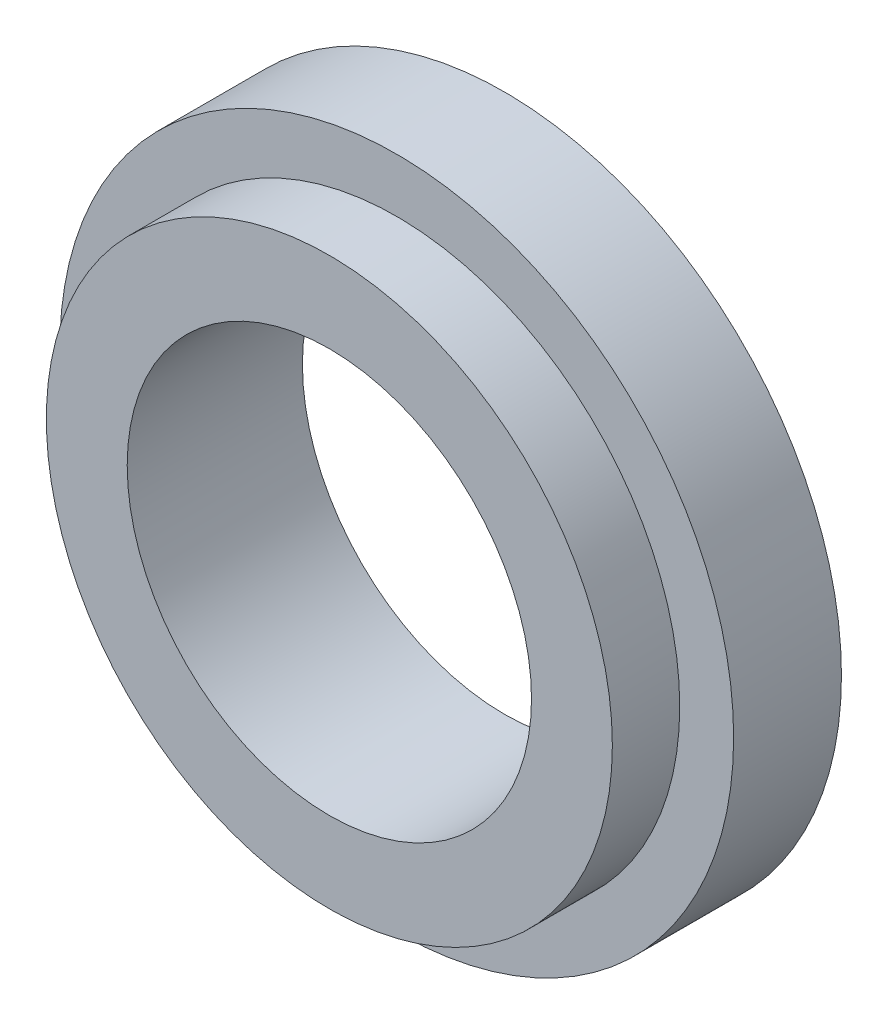
ISO-10303-21;
HEADER;
FILE_DESCRIPTION(('STEP AP214'),'2;1');
FILE_NAME('part.step','',(''),(''),'','','');
FILE_SCHEMA(('AUTOMOTIVE_DESIGN { 1 0 10303 214 1 1 1 1 }'));
ENDSEC;
DATA;
#1=APPLICATION_CONTEXT('core data for automotive mechanical design processes');
#2=APPLICATION_PROTOCOL_DEFINITION('international standard','automotive_design',2000,#1);
#3=PRODUCT_CONTEXT('',#1,'mechanical');
#4=PRODUCT('Part','Part','',(#3));
#5=PRODUCT_RELATED_PRODUCT_CATEGORY('part','',(#4));
#6=PRODUCT_DEFINITION_FORMATION('','',#4);
#7=PRODUCT_DEFINITION_CONTEXT('part definition',#1,'design');
#8=PRODUCT_DEFINITION('design','',#6,#7);
#9=PRODUCT_DEFINITION_SHAPE('','',#8);
#10=(LENGTH_UNIT() NAMED_UNIT(*) SI_UNIT(.MILLI.,.METRE.));
#11=(NAMED_UNIT(*) PLANE_ANGLE_UNIT() SI_UNIT($,.RADIAN.));
#12=(NAMED_UNIT(*) SI_UNIT($,.STERADIAN.) SOLID_ANGLE_UNIT());
#13=UNCERTAINTY_MEASURE_WITH_UNIT(LENGTH_MEASURE(1.E-05),#10,'distance_accuracy_value','');
#14=(GEOMETRIC_REPRESENTATION_CONTEXT(3) GLOBAL_UNCERTAINTY_ASSIGNED_CONTEXT((#13)) GLOBAL_UNIT_ASSIGNED_CONTEXT((#10,
#11,#12)) REPRESENTATION_CONTEXT('',''));
#15=CARTESIAN_POINT('',(0.,0.,0.));
#16=DIRECTION('',(0.,0.,1.));
#17=DIRECTION('',(1.,0.,0.));
#18=AXIS2_PLACEMENT_3D('',#15,#16,#17);
#19=CARTESIAN_POINT('',(0.,0.,8.));
#20=DIRECTION('',(0.,0.,1.));
#21=DIRECTION('',(1.,0.,0.));
#22=AXIS2_PLACEMENT_3D('',#19,#20,#21);
#23=PLANE('',#22);
#24=CARTESIAN_POINT('',(0.,0.,8.));
#25=DIRECTION('',(0.,0.,1.));
#26=DIRECTION('',(1.,0.,0.));
#27=AXIS2_PLACEMENT_3D('',#24,#25,#26);
#28=CIRCLE('',#27,25.);
#29=CARTESIAN_POINT('',(25.,0.,8.));
#30=VERTEX_POINT('',#29);
#31=EDGE_CURVE('E10',#30,#30,#28,.T.);
#32=ORIENTED_EDGE('',*,*,#31,.T.);
#33=EDGE_LOOP('',(#32));
#34=FACE_BOUND('',#33,.T.);
#35=CARTESIAN_POINT('',(0.,0.,8.));
#36=DIRECTION('',(0.,0.,1.));
#37=DIRECTION('',(1.,0.,0.));
#38=AXIS2_PLACEMENT_3D('',#35,#36,#37);
#39=CIRCLE('',#38,21.);
#40=CARTESIAN_POINT('',(21.,0.,8.));
#41=VERTEX_POINT('',#40);
#42=EDGE_CURVE('E45',#41,#41,#39,.T.);
#43=ORIENTED_EDGE('',*,*,#42,.F.);
#44=EDGE_LOOP('',(#43));
#45=FACE_BOUND('',#44,.T.);
#46=ADVANCED_FACE('F32',(#34,#45),#23,.T.);
#47=CARTESIAN_POINT('',(0.,0.,8.));
#48=DIRECTION('',(0.,0.,-1.));
#49=DIRECTION('',(-1.,0.,0.));
#50=AXIS2_PLACEMENT_3D('',#47,#48,#49);
#51=CYLINDRICAL_SURFACE('',#50,25.);
#52=ORIENTED_EDGE('',*,*,#31,.F.);
#53=EDGE_LOOP('',(#52));
#54=FACE_BOUND('',#53,.T.);
#55=CARTESIAN_POINT('',(0.,0.,0.));
#56=DIRECTION('',(0.,0.,1.));
#57=DIRECTION('',(1.,0.,0.));
#58=AXIS2_PLACEMENT_3D('',#55,#56,#57);
#59=CIRCLE('',#58,25.);
#60=CARTESIAN_POINT('',(25.,0.,0.));
#61=VERTEX_POINT('',#60);
#62=EDGE_CURVE('E36',#61,#61,#59,.T.);
#63=ORIENTED_EDGE('',*,*,#62,.T.);
#64=EDGE_LOOP('',(#63));
#65=FACE_BOUND('',#64,.T.);
#66=ADVANCED_FACE('F34',(#54,#65),#51,.T.);
#67=CARTESIAN_POINT('',(0.,0.,0.));
#68=DIRECTION('',(0.,0.,1.));
#69=DIRECTION('',(1.,0.,0.));
#70=AXIS2_PLACEMENT_3D('',#67,#68,#69);
#71=PLANE('',#70);
#72=CARTESIAN_POINT('',(0.,0.,0.));
#73=DIRECTION('',(0.,0.,1.));
#74=DIRECTION('',(1.,0.,0.));
#75=AXIS2_PLACEMENT_3D('',#72,#73,#74);
#76=CIRCLE('',#75,15.);
#77=CARTESIAN_POINT('',(15.,0.,0.));
#78=VERTEX_POINT('',#77);
#79=EDGE_CURVE('E48',#78,#78,#76,.T.);
#80=ORIENTED_EDGE('',*,*,#79,.T.);
#81=EDGE_LOOP('',(#80));
#82=FACE_BOUND('',#81,.T.);
#83=ORIENTED_EDGE('',*,*,#62,.F.);
#84=EDGE_LOOP('',(#83));
#85=FACE_BOUND('',#84,.T.);
#86=ADVANCED_FACE('F57',(#82,#85),#71,.F.);
#87=CARTESIAN_POINT('',(0.,0.,13.));
#88=DIRECTION('',(0.,0.,-1.));
#89=DIRECTION('',(-1.,0.,0.));
#90=AXIS2_PLACEMENT_3D('',#87,#88,#89);
#91=CYLINDRICAL_SURFACE('',#90,21.);
#92=CARTESIAN_POINT('',(0.,0.,13.));
#93=DIRECTION('',(0.,0.,1.));
#94=DIRECTION('',(1.,0.,0.));
#95=AXIS2_PLACEMENT_3D('',#92,#93,#94);
#96=CIRCLE('',#95,21.);
#97=CARTESIAN_POINT('',(21.,0.,13.));
#98=VERTEX_POINT('',#97);
#99=EDGE_CURVE('E43',#98,#98,#96,.T.);
#100=ORIENTED_EDGE('',*,*,#99,.F.);
#101=EDGE_LOOP('',(#100));
#102=FACE_BOUND('',#101,.T.);
#103=ORIENTED_EDGE('',*,*,#42,.T.);
#104=EDGE_LOOP('',(#103));
#105=FACE_BOUND('',#104,.T.);
#106=ADVANCED_FACE('F69',(#102,#105),#91,.T.);
#107=CARTESIAN_POINT('',(0.,0.,13.));
#108=DIRECTION('',(0.,0.,1.));
#109=DIRECTION('',(1.,0.,0.));
#110=AXIS2_PLACEMENT_3D('',#107,#108,#109);
#111=PLANE('',#110);
#112=CARTESIAN_POINT('',(0.,0.,13.));
#113=DIRECTION('',(0.,0.,1.));
#114=DIRECTION('',(1.,0.,0.));
#115=AXIS2_PLACEMENT_3D('',#112,#113,#114);
#116=CIRCLE('',#115,15.);
#117=CARTESIAN_POINT('',(15.,0.,13.));
#118=VERTEX_POINT('',#117);
#119=EDGE_CURVE('E51',#118,#118,#116,.T.);
#120=ORIENTED_EDGE('',*,*,#119,.F.);
#121=EDGE_LOOP('',(#120));
#122=FACE_BOUND('',#121,.T.);
#123=ORIENTED_EDGE('',*,*,#99,.T.);
#124=EDGE_LOOP('',(#123));
#125=FACE_BOUND('',#124,.T.);
#126=ADVANCED_FACE('F63',(#122,#125),#111,.T.);
#127=CARTESIAN_POINT('',(0.,0.,0.));
#128=DIRECTION('',(0.,0.,1.));
#129=DIRECTION('',(1.,0.,0.));
#130=AXIS2_PLACEMENT_3D('',#127,#128,#129);
#131=CYLINDRICAL_SURFACE('',#130,15.);
#132=CARTESIAN_POINT('',(15.,0.,0.));
#133=CARTESIAN_POINT('',(15.,0.,0.135416666666668));
#134=CARTESIAN_POINT('',(15.,0.,0.270833333333335));
#135=CARTESIAN_POINT('',(15.,0.,0.541666666666668));
#136=CARTESIAN_POINT('',(15.,0.,0.677083333333335));
#137=CARTESIAN_POINT('',(15.,0.,0.947916666666668));
#138=CARTESIAN_POINT('',(15.,0.,1.08333333333334));
#139=CARTESIAN_POINT('',(15.,0.,1.35416666666667));
#140=CARTESIAN_POINT('',(15.,0.,1.48958333333334));
#141=CARTESIAN_POINT('',(15.,0.,1.76041666666667));
#142=CARTESIAN_POINT('',(15.,0.,1.89583333333333));
#143=CARTESIAN_POINT('',(15.,0.,2.16666666666667));
#144=CARTESIAN_POINT('',(15.,0.,2.30208333333333));
#145=CARTESIAN_POINT('',(15.,0.,2.57291666666667));
#146=CARTESIAN_POINT('',(15.,0.,2.70833333333334));
#147=CARTESIAN_POINT('',(15.,0.,2.97916666666667));
#148=CARTESIAN_POINT('',(15.,0.,3.11458333333334));
#149=CARTESIAN_POINT('',(15.,0.,3.38541666666667));
#150=CARTESIAN_POINT('',(15.,0.,3.52083333333333));
#151=CARTESIAN_POINT('',(15.,0.,3.79166666666667));
#152=CARTESIAN_POINT('',(15.,0.,3.92708333333333));
#153=CARTESIAN_POINT('',(15.,0.,4.19791666666667));
#154=CARTESIAN_POINT('',(15.,0.,4.33333333333333));
#155=CARTESIAN_POINT('',(15.,0.,4.60416666666667));
#156=CARTESIAN_POINT('',(15.,0.,4.73958333333333));
#157=CARTESIAN_POINT('',(15.,0.,5.01041666666667));
#158=CARTESIAN_POINT('',(15.,0.,5.14583333333333));
#159=CARTESIAN_POINT('',(15.,0.,5.41666666666667));
#160=CARTESIAN_POINT('',(15.,0.,5.55208333333333));
#161=CARTESIAN_POINT('',(15.,0.,5.82291666666667));
#162=CARTESIAN_POINT('',(15.,0.,5.95833333333333));
#163=CARTESIAN_POINT('',(15.,0.,6.22916666666667));
#164=CARTESIAN_POINT('',(15.,0.,6.36458333333333));
#165=CARTESIAN_POINT('',(15.,0.,6.63541666666667));
#166=CARTESIAN_POINT('',(15.,0.,6.77083333333334));
#167=CARTESIAN_POINT('',(15.,0.,7.04166666666667));
#168=CARTESIAN_POINT('',(15.,0.,7.17708333333333));
#169=CARTESIAN_POINT('',(15.,0.,7.44791666666667));
#170=CARTESIAN_POINT('',(15.,0.,7.58333333333333));
#171=CARTESIAN_POINT('',(15.,0.,7.85416666666667));
#172=CARTESIAN_POINT('',(15.,0.,7.98958333333333));
#173=CARTESIAN_POINT('',(15.,0.,8.26041666666667));
#174=CARTESIAN_POINT('',(15.,0.,8.39583333333333));
#175=CARTESIAN_POINT('',(15.,0.,8.66666666666667));
#176=CARTESIAN_POINT('',(15.,0.,8.80208333333333));
#177=CARTESIAN_POINT('',(15.,0.,9.07291666666667));
#178=CARTESIAN_POINT('',(15.,0.,9.20833333333333));
#179=CARTESIAN_POINT('',(15.,0.,9.47916666666667));
#180=CARTESIAN_POINT('',(15.,0.,9.61458333333333));
#181=CARTESIAN_POINT('',(15.,0.,9.88541666666667));
#182=CARTESIAN_POINT('',(15.,0.,10.0208333333333));
#183=CARTESIAN_POINT('',(15.,0.,10.2916666666667));
#184=CARTESIAN_POINT('',(15.,0.,10.4270833333333));
#185=CARTESIAN_POINT('',(15.,0.,10.6979166666667));
#186=CARTESIAN_POINT('',(15.,0.,10.8333333333333));
#187=CARTESIAN_POINT('',(15.,0.,11.1041666666667));
#188=CARTESIAN_POINT('',(15.,0.,11.2395833333333));
#189=CARTESIAN_POINT('',(15.,0.,11.5104166666667));
#190=CARTESIAN_POINT('',(15.,0.,11.6458333333333));
#191=CARTESIAN_POINT('',(15.,0.,11.9166666666667));
#192=CARTESIAN_POINT('',(15.,0.,12.0520833333333));
#193=CARTESIAN_POINT('',(15.,0.,12.3229166666667));
#194=CARTESIAN_POINT('',(15.,0.,12.4583333333333));
#195=CARTESIAN_POINT('',(15.,0.,12.7291666666667));
#196=CARTESIAN_POINT('',(15.,0.,12.8645833333333));
#197=CARTESIAN_POINT('',(15.,0.,13.));
#198=B_SPLINE_CURVE_WITH_KNOTS('',3,(#132,#133,#134,#135,#136,#137,#138,#139,#140,#141,#142,
#143,#144,#145,#146,#147,#148,#149,#150,#151,#152,#153,#154,#155,#156,#157,#158,#159,#160,#161,
#162,#163,#164,#165,#166,#167,#168,#169,#170,#171,#172,#173,#174,#175,#176,#177,#178,#179,#180,
#181,#182,#183,#184,#185,#186,#187,#188,#189,#190,#191,#192,#193,#194,#195,#196,#197),
.UNSPECIFIED.,.F.,.F.,(4,2,2,2,2,2,2,2,2,2,2,2,2,2,2,2,2,2,2,2,2,2,2,2,2,2,2,2,2,2,2,2,4),(0.,
0.40625,0.8125,1.21875,1.625,2.03125,2.4375,2.84375,3.25,3.65625,4.0625,4.46875,4.875,5.28125,
5.6875,6.09375,6.5,6.90625,7.3125,7.71875,8.125,8.53125,8.9375,9.34375,9.75,10.15625,10.5625,
10.96875,11.375,11.78125,12.1875,12.59375,13.),.UNSPECIFIED.);
#199=EDGE_CURVE('BSEAM60',#78,#118,#198,.T.);
#200=ORIENTED_EDGE('',*,*,#79,.F.);
#201=ORIENTED_EDGE('',*,*,#119,.T.);
#202=ORIENTED_EDGE('',*,*,#199,.T.);
#203=ORIENTED_EDGE('',*,*,#199,.F.);
#204=EDGE_LOOP('',(#200,#202,#201,#203));
#205=FACE_BOUND('',#204,.T.);
#206=ADVANCED_FACE('F60',(#205),#131,.F.);
#207=CLOSED_SHELL('',(#46,#66,#86,#106,#126,#206));
#208=MANIFOLD_SOLID_BREP('B2',#207);
#209=ADVANCED_BREP_SHAPE_REPRESENTATION('',(#18,#208),#14);
#210=SHAPE_DEFINITION_REPRESENTATION(#9,#209);
ENDSEC;
END-ISO-10303-21;
